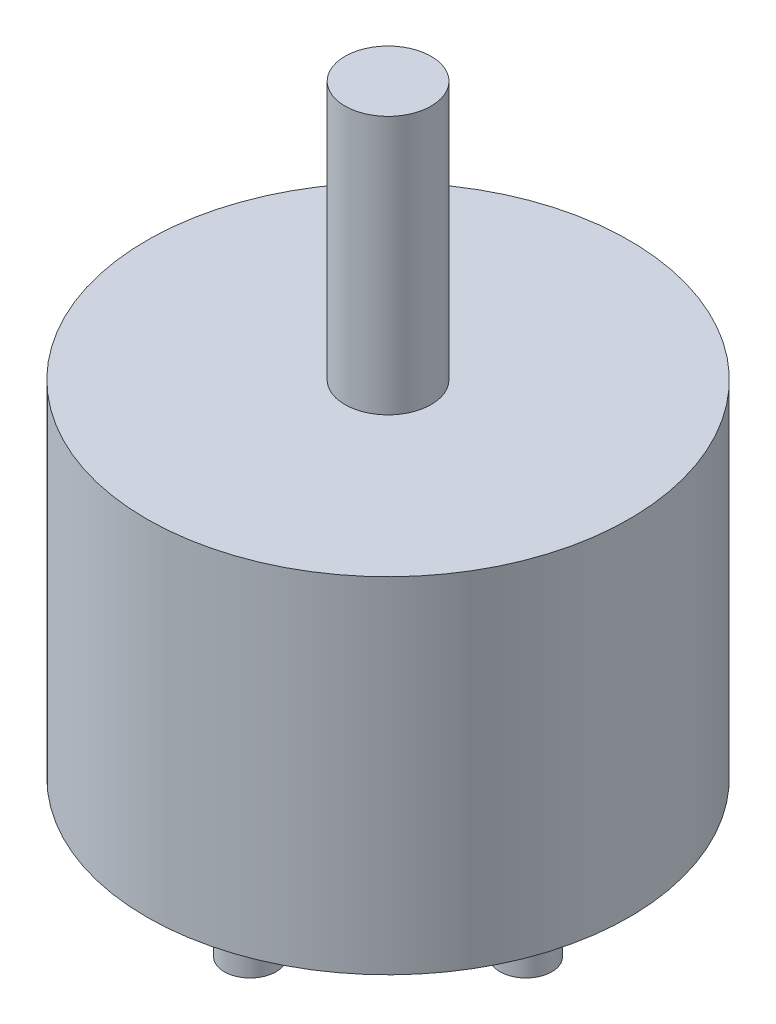
ISO-10303-21;
HEADER;
FILE_DESCRIPTION(('STEP AP214'),'2;1');
FILE_NAME('part.step','',(''),(''),'','','');
FILE_SCHEMA(('AUTOMOTIVE_DESIGN { 1 0 10303 214 1 1 1 1 }'));
ENDSEC;
DATA;
#1=APPLICATION_CONTEXT('core data for automotive mechanical design processes');
#2=APPLICATION_PROTOCOL_DEFINITION('international standard','automotive_design',2000,#1);
#3=PRODUCT_CONTEXT('',#1,'mechanical');
#4=PRODUCT('Part','Part','',(#3));
#5=PRODUCT_RELATED_PRODUCT_CATEGORY('part','',(#4));
#6=PRODUCT_DEFINITION_FORMATION('','',#4);
#7=PRODUCT_DEFINITION_CONTEXT('part definition',#1,'design');
#8=PRODUCT_DEFINITION('design','',#6,#7);
#9=PRODUCT_DEFINITION_SHAPE('','',#8);
#10=(LENGTH_UNIT() NAMED_UNIT(*) SI_UNIT(.MILLI.,.METRE.));
#11=(NAMED_UNIT(*) PLANE_ANGLE_UNIT() SI_UNIT($,.RADIAN.));
#12=(NAMED_UNIT(*) SI_UNIT($,.STERADIAN.) SOLID_ANGLE_UNIT());
#13=UNCERTAINTY_MEASURE_WITH_UNIT(LENGTH_MEASURE(1.E-05),#10,'distance_accuracy_value','');
#14=(GEOMETRIC_REPRESENTATION_CONTEXT(3) GLOBAL_UNCERTAINTY_ASSIGNED_CONTEXT((#13)) GLOBAL_UNIT_ASSIGNED_CONTEXT((#10,
#11,#12)) REPRESENTATION_CONTEXT('',''));
#15=CARTESIAN_POINT('',(0.,0.,0.));
#16=DIRECTION('',(0.,0.,1.));
#17=DIRECTION('',(1.,0.,0.));
#18=AXIS2_PLACEMENT_3D('',#15,#16,#17);
#19=CARTESIAN_POINT('',(0.,20.,0.));
#20=DIRECTION('',(0.,-1.,0.));
#21=DIRECTION('',(0.,0.,-1.));
#22=AXIS2_PLACEMENT_3D('',#19,#20,#21);
#23=CYLINDRICAL_SURFACE('',#22,14.);
#24=CARTESIAN_POINT('',(0.,20.,0.));
#25=DIRECTION('',(0.,1.,0.));
#26=DIRECTION('',(0.,0.,1.));
#27=AXIS2_PLACEMENT_3D('',#24,#25,#26);
#28=CIRCLE('',#27,14.);
#29=CARTESIAN_POINT('',(0.,20.,14.));
#30=VERTEX_POINT('',#29);
#31=EDGE_CURVE('E54',#30,#30,#28,.T.);
#32=ORIENTED_EDGE('',*,*,#31,.F.);
#33=EDGE_LOOP('',(#32));
#34=FACE_BOUND('',#33,.T.);
#35=CARTESIAN_POINT('',(0.,0.,0.));
#36=DIRECTION('',(0.,1.,0.));
#37=DIRECTION('',(0.,0.,1.));
#38=AXIS2_PLACEMENT_3D('',#35,#36,#37);
#39=CIRCLE('',#38,14.);
#40=CARTESIAN_POINT('',(0.,0.,14.));
#41=VERTEX_POINT('',#40);
#42=EDGE_CURVE('E51',#41,#41,#39,.T.);
#43=ORIENTED_EDGE('',*,*,#42,.T.);
#44=EDGE_LOOP('',(#43));
#45=FACE_BOUND('',#44,.T.);
#46=ADVANCED_FACE('F31',(#34,#45),#23,.T.);
#47=CARTESIAN_POINT('',(0.,20.,0.));
#48=DIRECTION('',(0.,1.,0.));
#49=DIRECTION('',(0.,0.,1.));
#50=AXIS2_PLACEMENT_3D('',#47,#48,#49);
#51=PLANE('',#50);
#52=CARTESIAN_POINT('',(0.,20.,0.));
#53=DIRECTION('',(0.,1.,0.));
#54=DIRECTION('',(0.,0.,1.));
#55=AXIS2_PLACEMENT_3D('',#52,#53,#54);
#56=CIRCLE('',#55,2.5);
#57=CARTESIAN_POINT('',(0.,20.,2.5));
#58=VERTEX_POINT('',#57);
#59=EDGE_CURVE('E50',#58,#58,#56,.T.);
#60=ORIENTED_EDGE('',*,*,#59,.F.);
#61=EDGE_LOOP('',(#60));
#62=FACE_BOUND('',#61,.T.);
#63=ORIENTED_EDGE('',*,*,#31,.T.);
#64=EDGE_LOOP('',(#63));
#65=FACE_BOUND('',#64,.T.);
#66=ADVANCED_FACE('F90',(#62,#65),#51,.T.);
#67=CARTESIAN_POINT('',(0.,0.,0.));
#68=DIRECTION('',(0.,1.,0.));
#69=DIRECTION('',(0.,0.,1.));
#70=AXIS2_PLACEMENT_3D('',#67,#68,#69);
#71=PLANE('',#70);
#72=CARTESIAN_POINT('',(-8.,0.,0.));
#73=DIRECTION('',(0.,1.,0.));
#74=DIRECTION('',(0.,0.,1.));
#75=AXIS2_PLACEMENT_3D('',#72,#73,#74);
#76=CIRCLE('',#75,1.43811386624312);
#77=CARTESIAN_POINT('',(-8.,0.,1.43811386624312));
#78=VERTEX_POINT('',#77);
#79=EDGE_CURVE('E10',#78,#78,#76,.F.);
#80=ORIENTED_EDGE('',*,*,#79,.F.);
#81=EDGE_LOOP('',(#80));
#82=FACE_BOUND('',#81,.T.);
#83=CARTESIAN_POINT('',(0.,0.,-8.));
#84=DIRECTION('',(0.,1.,0.));
#85=DIRECTION('',(0.,0.,1.));
#86=AXIS2_PLACEMENT_3D('',#83,#84,#85);
#87=CIRCLE('',#86,1.5);
#88=CARTESIAN_POINT('',(0.,0.,-6.5));
#89=VERTEX_POINT('',#88);
#90=EDGE_CURVE('E37',#89,#89,#87,.F.);
#91=ORIENTED_EDGE('',*,*,#90,.F.);
#92=EDGE_LOOP('',(#91));
#93=FACE_BOUND('',#92,.T.);
#94=CARTESIAN_POINT('',(8.,0.,0.));
#95=DIRECTION('',(0.,1.,0.));
#96=DIRECTION('',(0.,0.,1.));
#97=AXIS2_PLACEMENT_3D('',#94,#95,#96);
#98=CIRCLE('',#97,1.5);
#99=CARTESIAN_POINT('',(8.,0.,1.5));
#100=VERTEX_POINT('',#99);
#101=EDGE_CURVE('E41',#100,#100,#98,.F.);
#102=ORIENTED_EDGE('',*,*,#101,.F.);
#103=EDGE_LOOP('',(#102));
#104=FACE_BOUND('',#103,.T.);
#105=CARTESIAN_POINT('',(0.,0.,8.));
#106=DIRECTION('',(0.,1.,0.));
#107=DIRECTION('',(0.,0.,1.));
#108=AXIS2_PLACEMENT_3D('',#105,#106,#107);
#109=CIRCLE('',#108,1.5);
#110=CARTESIAN_POINT('',(0.,0.,9.5));
#111=VERTEX_POINT('',#110);
#112=EDGE_CURVE('E45',#111,#111,#109,.F.);
#113=ORIENTED_EDGE('',*,*,#112,.F.);
#114=EDGE_LOOP('',(#113));
#115=FACE_BOUND('',#114,.T.);
#116=ORIENTED_EDGE('',*,*,#42,.F.);
#117=EDGE_LOOP('',(#116));
#118=FACE_BOUND('',#117,.T.);
#119=ADVANCED_FACE('F95',(#82,#93,#104,#115,#118),#71,.F.);
#120=CARTESIAN_POINT('',(0.,35.,0.));
#121=DIRECTION('',(0.,-1.,0.));
#122=DIRECTION('',(0.,0.,-1.));
#123=AXIS2_PLACEMENT_3D('',#120,#121,#122);
#124=CYLINDRICAL_SURFACE('',#123,2.5);
#125=CARTESIAN_POINT('',(0.,35.,0.));
#126=DIRECTION('',(0.,1.,0.));
#127=DIRECTION('',(0.,0.,1.));
#128=AXIS2_PLACEMENT_3D('',#125,#126,#127);
#129=CIRCLE('',#128,2.5);
#130=CARTESIAN_POINT('',(0.,35.,2.5));
#131=VERTEX_POINT('',#130);
#132=EDGE_CURVE('E55',#131,#131,#129,.T.);
#133=ORIENTED_EDGE('',*,*,#132,.F.);
#134=EDGE_LOOP('',(#133));
#135=FACE_BOUND('',#134,.T.);
#136=ORIENTED_EDGE('',*,*,#59,.T.);
#137=EDGE_LOOP('',(#136));
#138=FACE_BOUND('',#137,.T.);
#139=ADVANCED_FACE('F103',(#135,#138),#124,.T.);
#140=CARTESIAN_POINT('',(0.,35.,0.));
#141=DIRECTION('',(0.,1.,0.));
#142=DIRECTION('',(0.,0.,1.));
#143=AXIS2_PLACEMENT_3D('',#140,#141,#142);
#144=PLANE('',#143);
#145=ORIENTED_EDGE('',*,*,#132,.T.);
#146=EDGE_LOOP('',(#145));
#147=FACE_BOUND('',#146,.T.);
#148=ADVANCED_FACE('F108',(#147),#144,.T.);
#149=CARTESIAN_POINT('',(0.,-5.,8.));
#150=DIRECTION('',(0.,1.,0.));
#151=DIRECTION('',(0.,0.,1.));
#152=AXIS2_PLACEMENT_3D('',#149,#150,#151);
#153=CYLINDRICAL_SURFACE('',#152,1.5);
#154=CARTESIAN_POINT('',(0.,-5.,8.));
#155=DIRECTION('',(0.,-1.,0.));
#156=DIRECTION('',(0.,0.,-1.));
#157=AXIS2_PLACEMENT_3D('',#154,#155,#156);
#158=CIRCLE('',#157,1.5);
#159=CARTESIAN_POINT('',(0.,-5.,6.5));
#160=VERTEX_POINT('',#159);
#161=EDGE_CURVE('E62',#160,#160,#158,.T.);
#162=ORIENTED_EDGE('',*,*,#161,.F.);
#163=EDGE_LOOP('',(#162));
#164=FACE_BOUND('',#163,.T.);
#165=ORIENTED_EDGE('',*,*,#112,.T.);
#166=EDGE_LOOP('',(#165));
#167=FACE_BOUND('',#166,.T.);
#168=ADVANCED_FACE('F115',(#164,#167),#153,.T.);
#169=CARTESIAN_POINT('',(0.,-5.,8.));
#170=DIRECTION('',(0.,-1.,0.));
#171=DIRECTION('',(0.,0.,-1.));
#172=AXIS2_PLACEMENT_3D('',#169,#170,#171);
#173=PLANE('',#172);
#174=ORIENTED_EDGE('',*,*,#161,.T.);
#175=EDGE_LOOP('',(#174));
#176=FACE_BOUND('',#175,.T.);
#177=ADVANCED_FACE('F119',(#176),#173,.T.);
#178=CARTESIAN_POINT('',(8.,-5.,0.));
#179=DIRECTION('',(0.,1.,0.));
#180=DIRECTION('',(0.,0.,1.));
#181=AXIS2_PLACEMENT_3D('',#178,#179,#180);
#182=CYLINDRICAL_SURFACE('',#181,1.5);
#183=CARTESIAN_POINT('',(8.,-5.,0.));
#184=DIRECTION('',(0.,-1.,0.));
#185=DIRECTION('',(0.,0.,-1.));
#186=AXIS2_PLACEMENT_3D('',#183,#184,#185);
#187=CIRCLE('',#186,1.5);
#188=CARTESIAN_POINT('',(8.,-5.,-1.5));
#189=VERTEX_POINT('',#188);
#190=EDGE_CURVE('E65',#189,#189,#187,.T.);
#191=ORIENTED_EDGE('',*,*,#190,.F.);
#192=EDGE_LOOP('',(#191));
#193=FACE_BOUND('',#192,.T.);
#194=ORIENTED_EDGE('',*,*,#101,.T.);
#195=EDGE_LOOP('',(#194));
#196=FACE_BOUND('',#195,.T.);
#197=ADVANCED_FACE('F123',(#193,#196),#182,.T.);
#198=CARTESIAN_POINT('',(8.,-5.,0.));
#199=DIRECTION('',(0.,-1.,0.));
#200=DIRECTION('',(0.,0.,-1.));
#201=AXIS2_PLACEMENT_3D('',#198,#199,#200);
#202=PLANE('',#201);
#203=ORIENTED_EDGE('',*,*,#190,.T.);
#204=EDGE_LOOP('',(#203));
#205=FACE_BOUND('',#204,.T.);
#206=ADVANCED_FACE('F127',(#205),#202,.T.);
#207=CARTESIAN_POINT('',(0.,-5.,-8.));
#208=DIRECTION('',(0.,1.,0.));
#209=DIRECTION('',(0.,0.,1.));
#210=AXIS2_PLACEMENT_3D('',#207,#208,#209);
#211=CYLINDRICAL_SURFACE('',#210,1.5);
#212=CARTESIAN_POINT('',(0.,-5.,-8.));
#213=DIRECTION('',(0.,-1.,0.));
#214=DIRECTION('',(0.,0.,-1.));
#215=AXIS2_PLACEMENT_3D('',#212,#213,#214);
#216=CIRCLE('',#215,1.5);
#217=CARTESIAN_POINT('',(0.,-5.,-9.5));
#218=VERTEX_POINT('',#217);
#219=EDGE_CURVE('E68',#218,#218,#216,.T.);
#220=ORIENTED_EDGE('',*,*,#219,.F.);
#221=EDGE_LOOP('',(#220));
#222=FACE_BOUND('',#221,.T.);
#223=ORIENTED_EDGE('',*,*,#90,.T.);
#224=EDGE_LOOP('',(#223));
#225=FACE_BOUND('',#224,.T.);
#226=ADVANCED_FACE('F86',(#222,#225),#211,.T.);
#227=CARTESIAN_POINT('',(0.,-5.,-8.));
#228=DIRECTION('',(0.,-1.,0.));
#229=DIRECTION('',(0.,0.,-1.));
#230=AXIS2_PLACEMENT_3D('',#227,#228,#229);
#231=PLANE('',#230);
#232=ORIENTED_EDGE('',*,*,#219,.T.);
#233=EDGE_LOOP('',(#232));
#234=FACE_BOUND('',#233,.T.);
#235=ADVANCED_FACE('F79',(#234),#231,.T.);
#236=CARTESIAN_POINT('',(-8.,-5.,0.));
#237=DIRECTION('',(0.,1.,0.));
#238=DIRECTION('',(0.,0.,1.));
#239=AXIS2_PLACEMENT_3D('',#236,#237,#238);
#240=CYLINDRICAL_SURFACE('',#239,1.43811386624312);
#241=CARTESIAN_POINT('',(-8.,-5.,0.));
#242=DIRECTION('',(0.,-1.,0.));
#243=DIRECTION('',(0.,0.,-1.));
#244=AXIS2_PLACEMENT_3D('',#241,#242,#243);
#245=CIRCLE('',#244,1.43811386624312);
#246=CARTESIAN_POINT('',(-8.,-5.,-1.43811386624312));
#247=VERTEX_POINT('',#246);
#248=EDGE_CURVE('E71',#247,#247,#245,.T.);
#249=ORIENTED_EDGE('',*,*,#248,.F.);
#250=EDGE_LOOP('',(#249));
#251=FACE_BOUND('',#250,.T.);
#252=ORIENTED_EDGE('',*,*,#79,.T.);
#253=EDGE_LOOP('',(#252));
#254=FACE_BOUND('',#253,.T.);
#255=ADVANCED_FACE('F77',(#251,#254),#240,.T.);
#256=CARTESIAN_POINT('',(-8.,-5.,0.));
#257=DIRECTION('',(0.,-1.,0.));
#258=DIRECTION('',(0.,0.,-1.));
#259=AXIS2_PLACEMENT_3D('',#256,#257,#258);
#260=PLANE('',#259);
#261=ORIENTED_EDGE('',*,*,#248,.T.);
#262=EDGE_LOOP('',(#261));
#263=FACE_BOUND('',#262,.T.);
#264=ADVANCED_FACE('F75',(#263),#260,.T.);
#265=CLOSED_SHELL('',(#46,#66,#119,#139,#148,#168,#177,#197,#206,#226,#235,#255,#264));
#266=MANIFOLD_SOLID_BREP('B2',#265);
#267=ADVANCED_BREP_SHAPE_REPRESENTATION('',(#18,#266),#14);
#268=SHAPE_DEFINITION_REPRESENTATION(#9,#267);
ENDSEC;
END-ISO-10303-21;
